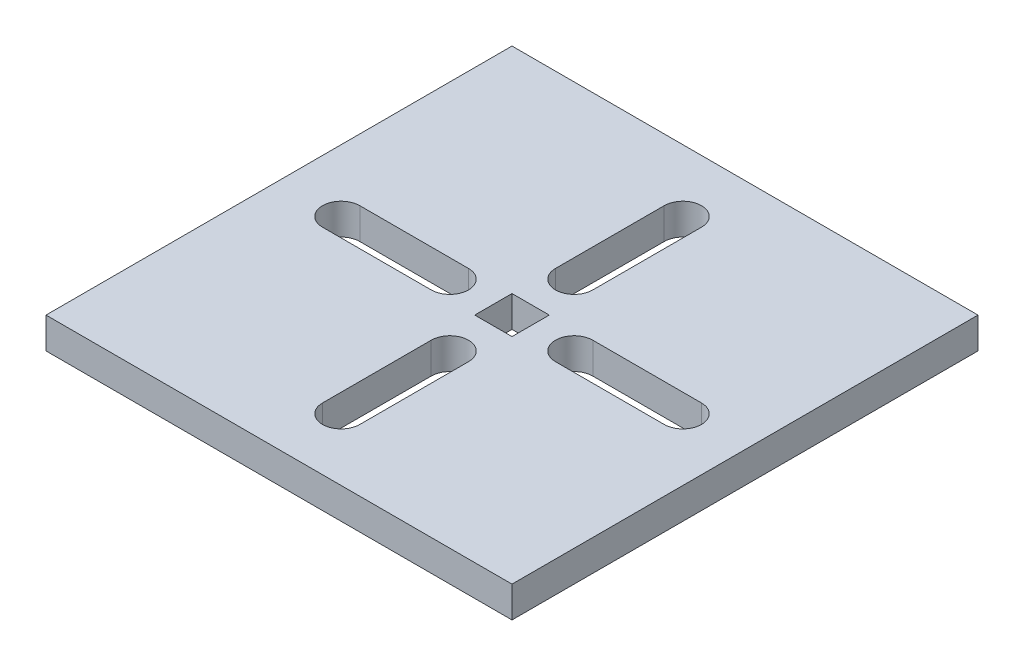
ISO-10303-21;
HEADER;
FILE_DESCRIPTION(('STEP AP214'),'2;1');
FILE_NAME('part.step','',(''),(''),'','','');
FILE_SCHEMA(('AUTOMOTIVE_DESIGN { 1 0 10303 214 1 1 1 1 }'));
ENDSEC;
DATA;
#1=APPLICATION_CONTEXT('core data for automotive mechanical design processes');
#2=APPLICATION_PROTOCOL_DEFINITION('international standard','automotive_design',2000,#1);
#3=PRODUCT_CONTEXT('',#1,'mechanical');
#4=PRODUCT('Part','Part','',(#3));
#5=PRODUCT_RELATED_PRODUCT_CATEGORY('part','',(#4));
#6=PRODUCT_DEFINITION_FORMATION('','',#4);
#7=PRODUCT_DEFINITION_CONTEXT('part definition',#1,'design');
#8=PRODUCT_DEFINITION('design','',#6,#7);
#9=PRODUCT_DEFINITION_SHAPE('','',#8);
#10=(LENGTH_UNIT() NAMED_UNIT(*) SI_UNIT(.MILLI.,.METRE.));
#11=(NAMED_UNIT(*) PLANE_ANGLE_UNIT() SI_UNIT($,.RADIAN.));
#12=(NAMED_UNIT(*) SI_UNIT($,.STERADIAN.) SOLID_ANGLE_UNIT());
#13=UNCERTAINTY_MEASURE_WITH_UNIT(LENGTH_MEASURE(1.E-05),#10,'distance_accuracy_value','');
#14=(GEOMETRIC_REPRESENTATION_CONTEXT(3) GLOBAL_UNCERTAINTY_ASSIGNED_CONTEXT((#13)) GLOBAL_UNIT_ASSIGNED_CONTEXT((#10,
#11,#12)) REPRESENTATION_CONTEXT('',''));
#15=CARTESIAN_POINT('',(0.,0.,0.));
#16=DIRECTION('',(0.,0.,1.));
#17=DIRECTION('',(1.,0.,0.));
#18=AXIS2_PLACEMENT_3D('',#15,#16,#17);
#19=CARTESIAN_POINT('',(75.0000000000455,10.,-75.0000000000455));
#20=DIRECTION('',(-1.,0.,0.));
#21=DIRECTION('',(0.,0.,1.));
#22=AXIS2_PLACEMENT_3D('',#19,#20,#21);
#23=PLANE('',#22);
#24=DIRECTION('',(0.,0.,-1.));
#25=VECTOR('',#24,1.);
#26=CARTESIAN_POINT('',(75.0000000000455,0.,-75.0000000000455));
#27=LINE('',#26,#25);
#28=CARTESIAN_POINT('',(75.0000000000455,0.,75.0000000000455));
#29=VERTEX_POINT('',#28);
#30=CARTESIAN_POINT('',(75.0000000000455,0.,-75.0000000000455));
#31=VERTEX_POINT('',#30);
#32=EDGE_CURVE('E416',#29,#31,#27,.T.);
#33=ORIENTED_EDGE('',*,*,#32,.T.);
#34=DIRECTION('',(0.,-1.,0.));
#35=VECTOR('',#34,1.);
#36=CARTESIAN_POINT('',(75.0000000000455,10.,-75.0000000000455));
#37=LINE('',#36,#35);
#38=CARTESIAN_POINT('',(75.0000000000455,10.,-75.0000000000455));
#39=VERTEX_POINT('',#38);
#40=EDGE_CURVE('E11',#39,#31,#37,.T.);
#41=ORIENTED_EDGE('',*,*,#40,.F.);
#42=DIRECTION('',(0.,0.,-1.));
#43=VECTOR('',#42,1.);
#44=CARTESIAN_POINT('',(75.0000000000455,10.,-75.0000000000455));
#45=LINE('',#44,#43);
#46=CARTESIAN_POINT('',(75.0000000000455,10.,75.0000000000455));
#47=VERTEX_POINT('',#46);
#48=EDGE_CURVE('E426',#47,#39,#45,.T.);
#49=ORIENTED_EDGE('',*,*,#48,.F.);
#50=DIRECTION('',(0.,-1.,0.));
#51=VECTOR('',#50,1.);
#52=CARTESIAN_POINT('',(75.0000000000455,10.,75.0000000000455));
#53=LINE('',#52,#51);
#54=EDGE_CURVE('E440',#47,#29,#53,.T.);
#55=ORIENTED_EDGE('',*,*,#54,.T.);
#56=EDGE_LOOP('',(#33,#41,#49,#55));
#57=FACE_BOUND('',#56,.T.);
#58=ADVANCED_FACE('F39',(#57),#23,.F.);
#59=CARTESIAN_POINT('',(-75.0000000000455,10.,-75.0000000000455));
#60=DIRECTION('',(0.,0.,1.));
#61=DIRECTION('',(1.,0.,0.));
#62=AXIS2_PLACEMENT_3D('',#59,#60,#61);
#63=PLANE('',#62);
#64=DIRECTION('',(-1.,0.,0.));
#65=VECTOR('',#64,1.);
#66=CARTESIAN_POINT('',(-75.0000000000455,0.,-75.0000000000455));
#67=LINE('',#66,#65);
#68=CARTESIAN_POINT('',(-75.0000000000455,0.,-75.0000000000455));
#69=VERTEX_POINT('',#68);
#70=EDGE_CURVE('E444',#31,#69,#67,.T.);
#71=ORIENTED_EDGE('',*,*,#70,.T.);
#72=DIRECTION('',(0.,-1.,0.));
#73=VECTOR('',#72,1.);
#74=CARTESIAN_POINT('',(-75.0000000000455,10.,-75.0000000000455));
#75=LINE('',#74,#73);
#76=CARTESIAN_POINT('',(-75.0000000000455,10.,-75.0000000000455));
#77=VERTEX_POINT('',#76);
#78=EDGE_CURVE('E47',#77,#69,#75,.T.);
#79=ORIENTED_EDGE('',*,*,#78,.F.);
#80=DIRECTION('',(-1.,0.,0.));
#81=VECTOR('',#80,1.);
#82=CARTESIAN_POINT('',(-75.0000000000455,10.,-75.0000000000455));
#83=LINE('',#82,#81);
#84=EDGE_CURVE('E430',#39,#77,#83,.T.);
#85=ORIENTED_EDGE('',*,*,#84,.F.);
#86=ORIENTED_EDGE('',*,*,#40,.T.);
#87=EDGE_LOOP('',(#71,#79,#85,#86));
#88=FACE_BOUND('',#87,.T.);
#89=ADVANCED_FACE('F479',(#88),#63,.F.);
#90=CARTESIAN_POINT('',(-75.0000000000455,10.,-75.0000000000455));
#91=DIRECTION('',(1.,0.,0.));
#92=DIRECTION('',(0.,0.,-1.));
#93=AXIS2_PLACEMENT_3D('',#90,#91,#92);
#94=PLANE('',#93);
#95=DIRECTION('',(0.,0.,1.));
#96=VECTOR('',#95,1.);
#97=CARTESIAN_POINT('',(-75.0000000000455,0.,-75.0000000000455));
#98=LINE('',#97,#96);
#99=CARTESIAN_POINT('',(-75.0000000000455,0.,75.0000000000455));
#100=VERTEX_POINT('',#99);
#101=EDGE_CURVE('E447',#69,#100,#98,.T.);
#102=ORIENTED_EDGE('',*,*,#101,.T.);
#103=DIRECTION('',(0.,-1.,0.));
#104=VECTOR('',#103,1.);
#105=CARTESIAN_POINT('',(-75.0000000000455,10.,75.0000000000455));
#106=LINE('',#105,#104);
#107=CARTESIAN_POINT('',(-75.0000000000455,10.,75.0000000000455));
#108=VERTEX_POINT('',#107);
#109=EDGE_CURVE('E455',#108,#100,#106,.T.);
#110=ORIENTED_EDGE('',*,*,#109,.F.);
#111=DIRECTION('',(0.,0.,1.));
#112=VECTOR('',#111,1.);
#113=CARTESIAN_POINT('',(-75.0000000000455,10.,-75.0000000000455));
#114=LINE('',#113,#112);
#115=EDGE_CURVE('E434',#77,#108,#114,.T.);
#116=ORIENTED_EDGE('',*,*,#115,.F.);
#117=ORIENTED_EDGE('',*,*,#78,.T.);
#118=EDGE_LOOP('',(#102,#110,#116,#117));
#119=FACE_BOUND('',#118,.T.);
#120=ADVANCED_FACE('F464',(#119),#94,.F.);
#121=CARTESIAN_POINT('',(-75.0000000000455,10.,75.0000000000455));
#122=DIRECTION('',(0.,0.,-1.));
#123=DIRECTION('',(-1.,0.,0.));
#124=AXIS2_PLACEMENT_3D('',#121,#122,#123);
#125=PLANE('',#124);
#126=DIRECTION('',(1.,0.,0.));
#127=VECTOR('',#126,1.);
#128=CARTESIAN_POINT('',(-75.0000000000455,0.,75.0000000000455));
#129=LINE('',#128,#127);
#130=EDGE_CURVE('E431',#100,#29,#129,.T.);
#131=ORIENTED_EDGE('',*,*,#130,.T.);
#132=ORIENTED_EDGE('',*,*,#54,.F.);
#133=DIRECTION('',(1.,0.,0.));
#134=VECTOR('',#133,1.);
#135=CARTESIAN_POINT('',(-75.0000000000455,10.,75.0000000000455));
#136=LINE('',#135,#134);
#137=EDGE_CURVE('E437',#108,#47,#136,.T.);
#138=ORIENTED_EDGE('',*,*,#137,.F.);
#139=ORIENTED_EDGE('',*,*,#109,.T.);
#140=EDGE_LOOP('',(#131,#132,#138,#139));
#141=FACE_BOUND('',#140,.T.);
#142=ADVANCED_FACE('F472',(#141),#125,.F.);
#143=CARTESIAN_POINT('',(0.,10.,0.));
#144=DIRECTION('',(0.,1.,0.));
#145=DIRECTION('',(0.,0.,1.));
#146=AXIS2_PLACEMENT_3D('',#143,#144,#145);
#147=PLANE('',#146);
#148=CARTESIAN_POINT('',(0.,10.,-20.));
#149=DIRECTION('',(0.,1.,0.));
#150=DIRECTION('',(1.,0.,0.));
#151=AXIS2_PLACEMENT_3D('',#148,#149,#150);
#152=CIRCLE('',#151,6.);
#153=CARTESIAN_POINT('',(-6.00000000000007,10.,-20.));
#154=VERTEX_POINT('',#153);
#155=CARTESIAN_POINT('',(5.99999999999993,10.,-20.));
#156=VERTEX_POINT('',#155);
#157=EDGE_CURVE('E54',#154,#156,#152,.T.);
#158=ORIENTED_EDGE('',*,*,#157,.F.);
#159=DIRECTION('',(0.,0.,1.));
#160=VECTOR('',#159,1.);
#161=CARTESIAN_POINT('',(-6.00000000000007,10.,-20.));
#162=LINE('',#161,#160);
#163=CARTESIAN_POINT('',(-6.00000000000019,10.,-55.));
#164=VERTEX_POINT('',#163);
#165=EDGE_CURVE('E224',#164,#154,#162,.T.);
#166=ORIENTED_EDGE('',*,*,#165,.F.);
#167=CARTESIAN_POINT('',(-1.92031473636372E-13,10.,-55.));
#168=DIRECTION('',(0.,1.,0.));
#169=DIRECTION('',(1.,0.,0.));
#170=AXIS2_PLACEMENT_3D('',#167,#168,#169);
#171=CIRCLE('',#170,6.);
#172=CARTESIAN_POINT('',(5.99999999999981,10.,-55.));
#173=VERTEX_POINT('',#172);
#174=EDGE_CURVE('E228',#173,#164,#171,.T.);
#175=ORIENTED_EDGE('',*,*,#174,.F.);
#176=DIRECTION('',(0.,0.,-1.));
#177=VECTOR('',#176,1.);
#178=CARTESIAN_POINT('',(5.99999999999993,10.,-20.));
#179=LINE('',#178,#177);
#180=EDGE_CURVE('E237',#156,#173,#179,.T.);
#181=ORIENTED_EDGE('',*,*,#180,.F.);
#182=EDGE_LOOP('',(#158,#166,#175,#181));
#183=FACE_BOUND('',#182,.T.);
#184=CARTESIAN_POINT('',(-20.,10.,0.));
#185=DIRECTION('',(0.,1.,0.));
#186=DIRECTION('',(0.,0.,-1.));
#187=AXIS2_PLACEMENT_3D('',#184,#185,#186);
#188=CIRCLE('',#187,6.);
#189=CARTESIAN_POINT('',(-20.,10.,6.));
#190=VERTEX_POINT('',#189);
#191=CARTESIAN_POINT('',(-20.,10.,-6.));
#192=VERTEX_POINT('',#191);
#193=EDGE_CURVE('E62',#190,#192,#188,.T.);
#194=ORIENTED_EDGE('',*,*,#193,.F.);
#195=DIRECTION('',(1.,0.,0.));
#196=VECTOR('',#195,1.);
#197=CARTESIAN_POINT('',(-20.,10.,6.));
#198=LINE('',#197,#196);
#199=CARTESIAN_POINT('',(-55.,10.,6.));
#200=VERTEX_POINT('',#199);
#201=EDGE_CURVE('E258',#200,#190,#198,.T.);
#202=ORIENTED_EDGE('',*,*,#201,.F.);
#203=CARTESIAN_POINT('',(-55.,10.,0.));
#204=DIRECTION('',(0.,1.,0.));
#205=DIRECTION('',(0.,0.,-1.));
#206=AXIS2_PLACEMENT_3D('',#203,#204,#205);
#207=CIRCLE('',#206,6.);
#208=CARTESIAN_POINT('',(-55.,10.,-6.));
#209=VERTEX_POINT('',#208);
#210=EDGE_CURVE('E278',#209,#200,#207,.T.);
#211=ORIENTED_EDGE('',*,*,#210,.F.);
#212=DIRECTION('',(-1.,0.,0.));
#213=VECTOR('',#212,1.);
#214=CARTESIAN_POINT('',(-20.,10.,-6.));
#215=LINE('',#214,#213);
#216=EDGE_CURVE('E273',#192,#209,#215,.T.);
#217=ORIENTED_EDGE('',*,*,#216,.F.);
#218=EDGE_LOOP('',(#194,#202,#211,#217));
#219=FACE_BOUND('',#218,.T.);
#220=CARTESIAN_POINT('',(2.09488880330588E-13,10.,20.));
#221=DIRECTION('',(0.,1.,0.));
#222=DIRECTION('',(-1.,0.,0.));
#223=AXIS2_PLACEMENT_3D('',#220,#221,#222);
#224=CIRCLE('',#223,6.);
#225=CARTESIAN_POINT('',(6.00000000000021,10.,19.9999999999999));
#226=VERTEX_POINT('',#225);
#227=CARTESIAN_POINT('',(-5.99999999999979,10.,20.0000000000001));
#228=VERTEX_POINT('',#227);
#229=EDGE_CURVE('E313',#226,#228,#224,.T.);
#230=ORIENTED_EDGE('',*,*,#229,.F.);
#231=DIRECTION('',(0.,0.,-1.));
#232=VECTOR('',#231,1.);
#233=CARTESIAN_POINT('',(6.00000000000021,10.,19.9999999999999));
#234=LINE('',#233,#232);
#235=CARTESIAN_POINT('',(6.00000000000058,10.,54.9999999999999));
#236=VERTEX_POINT('',#235);
#237=EDGE_CURVE('E300',#236,#226,#234,.T.);
#238=ORIENTED_EDGE('',*,*,#237,.F.);
#239=CARTESIAN_POINT('',(5.76094420909117E-13,10.,55.));
#240=DIRECTION('',(0.,1.,0.));
#241=DIRECTION('',(-1.,0.,0.));
#242=AXIS2_PLACEMENT_3D('',#239,#240,#241);
#243=CIRCLE('',#242,6.);
#244=CARTESIAN_POINT('',(-5.99999999999942,10.,55.0000000000001));
#245=VERTEX_POINT('',#244);
#246=EDGE_CURVE('E320',#245,#236,#243,.T.);
#247=ORIENTED_EDGE('',*,*,#246,.F.);
#248=DIRECTION('',(0.,0.,1.));
#249=VECTOR('',#248,1.);
#250=CARTESIAN_POINT('',(-5.99999999999979,10.,20.0000000000001));
#251=LINE('',#250,#249);
#252=EDGE_CURVE('E316',#228,#245,#251,.T.);
#253=ORIENTED_EDGE('',*,*,#252,.F.);
#254=EDGE_LOOP('',(#230,#238,#247,#253));
#255=FACE_BOUND('',#254,.T.);
#256=CARTESIAN_POINT('',(20.,10.,0.));
#257=DIRECTION('',(0.,1.,0.));
#258=DIRECTION('',(0.,0.,1.));
#259=AXIS2_PLACEMENT_3D('',#256,#257,#258);
#260=CIRCLE('',#259,6.);
#261=CARTESIAN_POINT('',(20.,10.,-6.));
#262=VERTEX_POINT('',#261);
#263=CARTESIAN_POINT('',(20.,10.,6.));
#264=VERTEX_POINT('',#263);
#265=EDGE_CURVE('E247',#262,#264,#260,.T.);
#266=ORIENTED_EDGE('',*,*,#265,.F.);
#267=DIRECTION('',(-1.,0.,0.));
#268=VECTOR('',#267,1.);
#269=CARTESIAN_POINT('',(20.,10.,-6.));
#270=LINE('',#269,#268);
#271=CARTESIAN_POINT('',(55.,10.,-6.));
#272=VERTEX_POINT('',#271);
#273=EDGE_CURVE('E343',#272,#262,#270,.T.);
#274=ORIENTED_EDGE('',*,*,#273,.F.);
#275=CARTESIAN_POINT('',(55.,10.,0.));
#276=DIRECTION('',(0.,1.,0.));
#277=DIRECTION('',(0.,0.,1.));
#278=AXIS2_PLACEMENT_3D('',#275,#276,#277);
#279=CIRCLE('',#278,6.);
#280=CARTESIAN_POINT('',(55.,10.,6.));
#281=VERTEX_POINT('',#280);
#282=EDGE_CURVE('E362',#281,#272,#279,.T.);
#283=ORIENTED_EDGE('',*,*,#282,.F.);
#284=DIRECTION('',(1.,0.,0.));
#285=VECTOR('',#284,1.);
#286=CARTESIAN_POINT('',(20.,10.,6.));
#287=LINE('',#286,#285);
#288=EDGE_CURVE('E358',#264,#281,#287,.T.);
#289=ORIENTED_EDGE('',*,*,#288,.F.);
#290=EDGE_LOOP('',(#266,#274,#283,#289));
#291=FACE_BOUND('',#290,.T.);
#292=DIRECTION('',(0.,0.,-1.));
#293=VECTOR('',#292,1.);
#294=CARTESIAN_POINT('',(6.,10.,-6.));
#295=LINE('',#294,#293);
#296=CARTESIAN_POINT('',(6.,10.,6.));
#297=VERTEX_POINT('',#296);
#298=CARTESIAN_POINT('',(6.,10.,-6.));
#299=VERTEX_POINT('',#298);
#300=EDGE_CURVE('E372',#297,#299,#295,.T.);
#301=ORIENTED_EDGE('',*,*,#300,.F.);
#302=DIRECTION('',(1.,0.,0.));
#303=VECTOR('',#302,1.);
#304=CARTESIAN_POINT('',(-6.,10.,6.));
#305=LINE('',#304,#303);
#306=CARTESIAN_POINT('',(-6.,10.,6.));
#307=VERTEX_POINT('',#306);
#308=EDGE_CURVE('E387',#307,#297,#305,.T.);
#309=ORIENTED_EDGE('',*,*,#308,.F.);
#310=DIRECTION('',(0.,0.,1.));
#311=VECTOR('',#310,1.);
#312=CARTESIAN_POINT('',(-6.,10.,-6.));
#313=LINE('',#312,#311);
#314=CARTESIAN_POINT('',(-6.,10.,-6.));
#315=VERTEX_POINT('',#314);
#316=EDGE_CURVE('E406',#315,#307,#313,.T.);
#317=ORIENTED_EDGE('',*,*,#316,.F.);
#318=DIRECTION('',(-1.,0.,0.));
#319=VECTOR('',#318,1.);
#320=CARTESIAN_POINT('',(-6.,10.,-6.));
#321=LINE('',#320,#319);
#322=EDGE_CURVE('E402',#299,#315,#321,.T.);
#323=ORIENTED_EDGE('',*,*,#322,.F.);
#324=EDGE_LOOP('',(#301,#309,#317,#323));
#325=FACE_BOUND('',#324,.T.);
#326=ORIENTED_EDGE('',*,*,#48,.T.);
#327=ORIENTED_EDGE('',*,*,#84,.T.);
#328=ORIENTED_EDGE('',*,*,#115,.T.);
#329=ORIENTED_EDGE('',*,*,#137,.T.);
#330=EDGE_LOOP('',(#326,#327,#328,#329));
#331=FACE_BOUND('',#330,.T.);
#332=ADVANCED_FACE('F478',(#183,#219,#255,#291,#325,#331),#147,.T.);
#333=CARTESIAN_POINT('',(0.,0.,0.));
#334=DIRECTION('',(0.,1.,0.));
#335=DIRECTION('',(0.,0.,1.));
#336=AXIS2_PLACEMENT_3D('',#333,#334,#335);
#337=PLANE('',#336);
#338=DIRECTION('',(0.,0.,1.));
#339=VECTOR('',#338,1.);
#340=CARTESIAN_POINT('',(-6.00000000000007,0.,-20.));
#341=LINE('',#340,#339);
#342=CARTESIAN_POINT('',(-6.00000000000019,0.,-55.));
#343=VERTEX_POINT('',#342);
#344=CARTESIAN_POINT('',(-6.00000000000007,0.,-20.));
#345=VERTEX_POINT('',#344);
#346=EDGE_CURVE('E209',#343,#345,#341,.T.);
#347=ORIENTED_EDGE('',*,*,#346,.T.);
#348=CARTESIAN_POINT('',(0.,0.,-20.));
#349=DIRECTION('',(0.,1.,0.));
#350=DIRECTION('',(1.,0.,0.));
#351=AXIS2_PLACEMENT_3D('',#348,#349,#350);
#352=CIRCLE('',#351,6.);
#353=CARTESIAN_POINT('',(5.99999999999993,0.,-20.));
#354=VERTEX_POINT('',#353);
#355=EDGE_CURVE('E202',#345,#354,#352,.T.);
#356=ORIENTED_EDGE('',*,*,#355,.T.);
#357=DIRECTION('',(0.,0.,-1.));
#358=VECTOR('',#357,1.);
#359=CARTESIAN_POINT('',(5.99999999999993,0.,-20.));
#360=LINE('',#359,#358);
#361=CARTESIAN_POINT('',(5.99999999999981,0.,-55.));
#362=VERTEX_POINT('',#361);
#363=EDGE_CURVE('E213',#354,#362,#360,.T.);
#364=ORIENTED_EDGE('',*,*,#363,.T.);
#365=CARTESIAN_POINT('',(-1.92031473636372E-13,0.,-55.));
#366=DIRECTION('',(0.,1.,0.));
#367=DIRECTION('',(1.,0.,0.));
#368=AXIS2_PLACEMENT_3D('',#365,#366,#367);
#369=CIRCLE('',#368,6.);
#370=EDGE_CURVE('E218',#362,#343,#369,.T.);
#371=ORIENTED_EDGE('',*,*,#370,.T.);
#372=EDGE_LOOP('',(#347,#356,#364,#371));
#373=FACE_BOUND('',#372,.T.);
#374=DIRECTION('',(1.,0.,0.));
#375=VECTOR('',#374,1.);
#376=CARTESIAN_POINT('',(-20.,0.,6.));
#377=LINE('',#376,#375);
#378=CARTESIAN_POINT('',(-55.,0.,6.));
#379=VERTEX_POINT('',#378);
#380=CARTESIAN_POINT('',(-20.,0.,6.));
#381=VERTEX_POINT('',#380);
#382=EDGE_CURVE('E266',#379,#381,#377,.T.);
#383=ORIENTED_EDGE('',*,*,#382,.T.);
#384=CARTESIAN_POINT('',(-20.,0.,0.));
#385=DIRECTION('',(0.,1.,0.));
#386=DIRECTION('',(0.,0.,-1.));
#387=AXIS2_PLACEMENT_3D('',#384,#385,#386);
#388=CIRCLE('',#387,6.);
#389=CARTESIAN_POINT('',(-20.,0.,-6.));
#390=VERTEX_POINT('',#389);
#391=EDGE_CURVE('E253',#381,#390,#388,.T.);
#392=ORIENTED_EDGE('',*,*,#391,.T.);
#393=DIRECTION('',(-1.,0.,0.));
#394=VECTOR('',#393,1.);
#395=CARTESIAN_POINT('',(-20.,0.,-6.));
#396=LINE('',#395,#394);
#397=CARTESIAN_POINT('',(-55.,0.,-6.));
#398=VERTEX_POINT('',#397);
#399=EDGE_CURVE('E257',#390,#398,#396,.T.);
#400=ORIENTED_EDGE('',*,*,#399,.T.);
#401=CARTESIAN_POINT('',(-55.,0.,0.));
#402=DIRECTION('',(0.,1.,0.));
#403=DIRECTION('',(0.,0.,-1.));
#404=AXIS2_PLACEMENT_3D('',#401,#402,#403);
#405=CIRCLE('',#404,6.);
#406=EDGE_CURVE('E262',#398,#379,#405,.T.);
#407=ORIENTED_EDGE('',*,*,#406,.T.);
#408=EDGE_LOOP('',(#383,#392,#400,#407));
#409=FACE_BOUND('',#408,.T.);
#410=DIRECTION('',(0.,0.,-1.));
#411=VECTOR('',#410,1.);
#412=CARTESIAN_POINT('',(6.00000000000021,0.,19.9999999999999));
#413=LINE('',#412,#411);
#414=CARTESIAN_POINT('',(6.00000000000058,0.,54.9999999999999));
#415=VERTEX_POINT('',#414);
#416=CARTESIAN_POINT('',(6.00000000000021,0.,19.9999999999999));
#417=VERTEX_POINT('',#416);
#418=EDGE_CURVE('E308',#415,#417,#413,.T.);
#419=ORIENTED_EDGE('',*,*,#418,.T.);
#420=CARTESIAN_POINT('',(2.09488880330588E-13,0.,20.));
#421=DIRECTION('',(0.,1.,0.));
#422=DIRECTION('',(-1.,0.,0.));
#423=AXIS2_PLACEMENT_3D('',#420,#421,#422);
#424=CIRCLE('',#423,6.);
#425=CARTESIAN_POINT('',(-5.99999999999979,0.,20.0000000000001));
#426=VERTEX_POINT('',#425);
#427=EDGE_CURVE('E295',#417,#426,#424,.T.);
#428=ORIENTED_EDGE('',*,*,#427,.T.);
#429=DIRECTION('',(0.,0.,1.));
#430=VECTOR('',#429,1.);
#431=CARTESIAN_POINT('',(-5.99999999999979,0.,20.0000000000001));
#432=LINE('',#431,#430);
#433=CARTESIAN_POINT('',(-5.99999999999942,0.,55.0000000000001));
#434=VERTEX_POINT('',#433);
#435=EDGE_CURVE('E299',#426,#434,#432,.T.);
#436=ORIENTED_EDGE('',*,*,#435,.T.);
#437=CARTESIAN_POINT('',(5.76094420909117E-13,0.,55.));
#438=DIRECTION('',(0.,1.,0.));
#439=DIRECTION('',(-1.,0.,0.));
#440=AXIS2_PLACEMENT_3D('',#437,#438,#439);
#441=CIRCLE('',#440,6.);
#442=EDGE_CURVE('E304',#434,#415,#441,.T.);
#443=ORIENTED_EDGE('',*,*,#442,.T.);
#444=EDGE_LOOP('',(#419,#428,#436,#443));
#445=FACE_BOUND('',#444,.T.);
#446=DIRECTION('',(-1.,0.,0.));
#447=VECTOR('',#446,1.);
#448=CARTESIAN_POINT('',(20.,0.,-6.));
#449=LINE('',#448,#447);
#450=CARTESIAN_POINT('',(55.,0.,-6.));
#451=VERTEX_POINT('',#450);
#452=CARTESIAN_POINT('',(20.,0.,-6.));
#453=VERTEX_POINT('',#452);
#454=EDGE_CURVE('E351',#451,#453,#449,.T.);
#455=ORIENTED_EDGE('',*,*,#454,.T.);
#456=CARTESIAN_POINT('',(20.,0.,0.));
#457=DIRECTION('',(0.,1.,0.));
#458=DIRECTION('',(0.,0.,1.));
#459=AXIS2_PLACEMENT_3D('',#456,#457,#458);
#460=CIRCLE('',#459,6.);
#461=CARTESIAN_POINT('',(20.,0.,6.));
#462=VERTEX_POINT('',#461);
#463=EDGE_CURVE('E338',#453,#462,#460,.T.);
#464=ORIENTED_EDGE('',*,*,#463,.T.);
#465=DIRECTION('',(1.,0.,0.));
#466=VECTOR('',#465,1.);
#467=CARTESIAN_POINT('',(20.,0.,6.));
#468=LINE('',#467,#466);
#469=CARTESIAN_POINT('',(55.,0.,6.));
#470=VERTEX_POINT('',#469);
#471=EDGE_CURVE('E342',#462,#470,#468,.T.);
#472=ORIENTED_EDGE('',*,*,#471,.T.);
#473=CARTESIAN_POINT('',(55.,0.,0.));
#474=DIRECTION('',(0.,1.,0.));
#475=DIRECTION('',(0.,0.,1.));
#476=AXIS2_PLACEMENT_3D('',#473,#474,#475);
#477=CIRCLE('',#476,6.);
#478=EDGE_CURVE('E347',#470,#451,#477,.T.);
#479=ORIENTED_EDGE('',*,*,#478,.T.);
#480=EDGE_LOOP('',(#455,#464,#472,#479));
#481=FACE_BOUND('',#480,.T.);
#482=DIRECTION('',(1.,0.,0.));
#483=VECTOR('',#482,1.);
#484=CARTESIAN_POINT('',(-6.,0.,6.));
#485=LINE('',#484,#483);
#486=CARTESIAN_POINT('',(-6.,0.,6.));
#487=VERTEX_POINT('',#486);
#488=CARTESIAN_POINT('',(6.,0.,6.));
#489=VERTEX_POINT('',#488);
#490=EDGE_CURVE('E395',#487,#489,#485,.T.);
#491=ORIENTED_EDGE('',*,*,#490,.T.);
#492=DIRECTION('',(0.,0.,-1.));
#493=VECTOR('',#492,1.);
#494=CARTESIAN_POINT('',(6.,0.,-6.));
#495=LINE('',#494,#493);
#496=CARTESIAN_POINT('',(6.,0.,-6.));
#497=VERTEX_POINT('',#496);
#498=EDGE_CURVE('E382',#489,#497,#495,.T.);
#499=ORIENTED_EDGE('',*,*,#498,.T.);
#500=DIRECTION('',(-1.,0.,0.));
#501=VECTOR('',#500,1.);
#502=CARTESIAN_POINT('',(-6.,0.,-6.));
#503=LINE('',#502,#501);
#504=CARTESIAN_POINT('',(-6.,0.,-6.));
#505=VERTEX_POINT('',#504);
#506=EDGE_CURVE('E386',#497,#505,#503,.T.);
#507=ORIENTED_EDGE('',*,*,#506,.T.);
#508=DIRECTION('',(0.,0.,1.));
#509=VECTOR('',#508,1.);
#510=CARTESIAN_POINT('',(-6.,0.,-6.));
#511=LINE('',#510,#509);
#512=EDGE_CURVE('E391',#505,#487,#511,.T.);
#513=ORIENTED_EDGE('',*,*,#512,.T.);
#514=EDGE_LOOP('',(#491,#499,#507,#513));
#515=FACE_BOUND('',#514,.T.);
#516=ORIENTED_EDGE('',*,*,#32,.F.);
#517=ORIENTED_EDGE('',*,*,#130,.F.);
#518=ORIENTED_EDGE('',*,*,#101,.F.);
#519=ORIENTED_EDGE('',*,*,#70,.F.);
#520=EDGE_LOOP('',(#516,#517,#518,#519));
#521=FACE_BOUND('',#520,.T.);
#522=ADVANCED_FACE('F220',(#373,#409,#445,#481,#515,#521),#337,.F.);
#523=CARTESIAN_POINT('',(6.,0.,-6.));
#524=DIRECTION('',(1.,0.,0.));
#525=DIRECTION('',(0.,0.,-1.));
#526=AXIS2_PLACEMENT_3D('',#523,#524,#525);
#527=PLANE('',#526);
#528=ORIENTED_EDGE('',*,*,#300,.T.);
#529=DIRECTION('',(0.,1.,0.));
#530=VECTOR('',#529,1.);
#531=CARTESIAN_POINT('',(6.,0.,-6.));
#532=LINE('',#531,#530);
#533=EDGE_CURVE('E399',#497,#299,#532,.T.);
#534=ORIENTED_EDGE('',*,*,#533,.F.);
#535=ORIENTED_EDGE('',*,*,#498,.F.);
#536=DIRECTION('',(0.,1.,0.));
#537=VECTOR('',#536,1.);
#538=CARTESIAN_POINT('',(6.,0.,6.));
#539=LINE('',#538,#537);
#540=EDGE_CURVE('E413',#489,#297,#539,.T.);
#541=ORIENTED_EDGE('',*,*,#540,.T.);
#542=EDGE_LOOP('',(#528,#534,#535,#541));
#543=FACE_BOUND('',#542,.T.);
#544=ADVANCED_FACE('F491',(#543),#527,.F.);
#545=CARTESIAN_POINT('',(-6.,0.,6.));
#546=DIRECTION('',(0.,0.,1.));
#547=DIRECTION('',(1.,0.,0.));
#548=AXIS2_PLACEMENT_3D('',#545,#546,#547);
#549=PLANE('',#548);
#550=ORIENTED_EDGE('',*,*,#308,.T.);
#551=ORIENTED_EDGE('',*,*,#540,.F.);
#552=ORIENTED_EDGE('',*,*,#490,.F.);
#553=DIRECTION('',(0.,1.,0.));
#554=VECTOR('',#553,1.);
#555=CARTESIAN_POINT('',(-6.,0.,6.));
#556=LINE('',#555,#554);
#557=EDGE_CURVE('E417',#487,#307,#556,.T.);
#558=ORIENTED_EDGE('',*,*,#557,.T.);
#559=EDGE_LOOP('',(#550,#551,#552,#558));
#560=FACE_BOUND('',#559,.T.);
#561=ADVANCED_FACE('F497',(#560),#549,.F.);
#562=CARTESIAN_POINT('',(-6.,0.,-6.));
#563=DIRECTION('',(-1.,0.,0.));
#564=DIRECTION('',(0.,0.,1.));
#565=AXIS2_PLACEMENT_3D('',#562,#563,#564);
#566=PLANE('',#565);
#567=ORIENTED_EDGE('',*,*,#316,.T.);
#568=ORIENTED_EDGE('',*,*,#557,.F.);
#569=ORIENTED_EDGE('',*,*,#512,.F.);
#570=DIRECTION('',(0.,1.,0.));
#571=VECTOR('',#570,1.);
#572=CARTESIAN_POINT('',(-6.,0.,-6.));
#573=LINE('',#572,#571);
#574=EDGE_CURVE('E420',#505,#315,#573,.T.);
#575=ORIENTED_EDGE('',*,*,#574,.T.);
#576=EDGE_LOOP('',(#567,#568,#569,#575));
#577=FACE_BOUND('',#576,.T.);
#578=ADVANCED_FACE('F503',(#577),#566,.F.);
#579=CARTESIAN_POINT('',(-6.,0.,-6.));
#580=DIRECTION('',(0.,0.,-1.));
#581=DIRECTION('',(-1.,0.,0.));
#582=AXIS2_PLACEMENT_3D('',#579,#580,#581);
#583=PLANE('',#582);
#584=ORIENTED_EDGE('',*,*,#322,.T.);
#585=ORIENTED_EDGE('',*,*,#574,.F.);
#586=ORIENTED_EDGE('',*,*,#506,.F.);
#587=ORIENTED_EDGE('',*,*,#533,.T.);
#588=EDGE_LOOP('',(#584,#585,#586,#587));
#589=FACE_BOUND('',#588,.T.);
#590=ADVANCED_FACE('F499',(#589),#583,.F.);
#591=CARTESIAN_POINT('',(20.,0.,0.));
#592=DIRECTION('',(0.,1.,0.));
#593=DIRECTION('',(0.,0.,1.));
#594=AXIS2_PLACEMENT_3D('',#591,#592,#593);
#595=CYLINDRICAL_SURFACE('',#594,6.);
#596=ORIENTED_EDGE('',*,*,#265,.T.);
#597=DIRECTION('',(0.,1.,0.));
#598=VECTOR('',#597,1.);
#599=CARTESIAN_POINT('',(20.,0.,6.));
#600=LINE('',#599,#598);
#601=EDGE_CURVE('E355',#462,#264,#600,.T.);
#602=ORIENTED_EDGE('',*,*,#601,.F.);
#603=ORIENTED_EDGE('',*,*,#463,.F.);
#604=DIRECTION('',(0.,1.,0.));
#605=VECTOR('',#604,1.);
#606=CARTESIAN_POINT('',(20.,0.,-6.));
#607=LINE('',#606,#605);
#608=EDGE_CURVE('E369',#453,#262,#607,.T.);
#609=ORIENTED_EDGE('',*,*,#608,.T.);
#610=EDGE_LOOP('',(#596,#602,#603,#609));
#611=FACE_BOUND('',#610,.T.);
#612=ADVANCED_FACE('F502',(#611),#595,.F.);
#613=CARTESIAN_POINT('',(20.,0.,-6.));
#614=DIRECTION('',(0.,0.,-1.));
#615=DIRECTION('',(-1.,0.,0.));
#616=AXIS2_PLACEMENT_3D('',#613,#614,#615);
#617=PLANE('',#616);
#618=ORIENTED_EDGE('',*,*,#273,.T.);
#619=ORIENTED_EDGE('',*,*,#608,.F.);
#620=ORIENTED_EDGE('',*,*,#454,.F.);
#621=DIRECTION('',(0.,1.,0.));
#622=VECTOR('',#621,1.);
#623=CARTESIAN_POINT('',(55.,0.,-6.));
#624=LINE('',#623,#622);
#625=EDGE_CURVE('E373',#451,#272,#624,.T.);
#626=ORIENTED_EDGE('',*,*,#625,.T.);
#627=EDGE_LOOP('',(#618,#619,#620,#626));
#628=FACE_BOUND('',#627,.T.);
#629=ADVANCED_FACE('F513',(#628),#617,.F.);
#630=CARTESIAN_POINT('',(55.,0.,0.));
#631=DIRECTION('',(0.,1.,0.));
#632=DIRECTION('',(0.,0.,1.));
#633=AXIS2_PLACEMENT_3D('',#630,#631,#632);
#634=CYLINDRICAL_SURFACE('',#633,6.);
#635=ORIENTED_EDGE('',*,*,#282,.T.);
#636=ORIENTED_EDGE('',*,*,#625,.F.);
#637=ORIENTED_EDGE('',*,*,#478,.F.);
#638=DIRECTION('',(0.,1.,0.));
#639=VECTOR('',#638,1.);
#640=CARTESIAN_POINT('',(55.,0.,6.));
#641=LINE('',#640,#639);
#642=EDGE_CURVE('E376',#470,#281,#641,.T.);
#643=ORIENTED_EDGE('',*,*,#642,.T.);
#644=EDGE_LOOP('',(#635,#636,#637,#643));
#645=FACE_BOUND('',#644,.T.);
#646=ADVANCED_FACE('F519',(#645),#634,.F.);
#647=CARTESIAN_POINT('',(20.,0.,6.));
#648=DIRECTION('',(0.,0.,1.));
#649=DIRECTION('',(1.,0.,0.));
#650=AXIS2_PLACEMENT_3D('',#647,#648,#649);
#651=PLANE('',#650);
#652=ORIENTED_EDGE('',*,*,#288,.T.);
#653=ORIENTED_EDGE('',*,*,#642,.F.);
#654=ORIENTED_EDGE('',*,*,#471,.F.);
#655=ORIENTED_EDGE('',*,*,#601,.T.);
#656=EDGE_LOOP('',(#652,#653,#654,#655));
#657=FACE_BOUND('',#656,.T.);
#658=ADVANCED_FACE('F515',(#657),#651,.F.);
#659=CARTESIAN_POINT('',(2.09488880330588E-13,0.,20.));
#660=DIRECTION('',(0.,1.,0.));
#661=DIRECTION('',(0.,0.,1.));
#662=AXIS2_PLACEMENT_3D('',#659,#660,#661);
#663=CYLINDRICAL_SURFACE('',#662,6.);
#664=ORIENTED_EDGE('',*,*,#229,.T.);
#665=DIRECTION('',(0.,1.,0.));
#666=VECTOR('',#665,1.);
#667=CARTESIAN_POINT('',(-5.99999999999979,0.,20.0000000000001));
#668=LINE('',#667,#666);
#669=EDGE_CURVE('E312',#426,#228,#668,.T.);
#670=ORIENTED_EDGE('',*,*,#669,.F.);
#671=ORIENTED_EDGE('',*,*,#427,.F.);
#672=DIRECTION('',(0.,1.,0.));
#673=VECTOR('',#672,1.);
#674=CARTESIAN_POINT('',(6.00000000000021,0.,19.9999999999999));
#675=LINE('',#674,#673);
#676=EDGE_CURVE('E274',#417,#226,#675,.T.);
#677=ORIENTED_EDGE('',*,*,#676,.T.);
#678=EDGE_LOOP('',(#664,#670,#671,#677));
#679=FACE_BOUND('',#678,.T.);
#680=ADVANCED_FACE('F518',(#679),#663,.F.);
#681=CARTESIAN_POINT('',(6.00000000000021,0.,19.9999999999999));
#682=DIRECTION('',(1.,0.,0.));
#683=DIRECTION('',(0.,0.,-1.));
#684=AXIS2_PLACEMENT_3D('',#681,#682,#683);
#685=PLANE('',#684);
#686=ORIENTED_EDGE('',*,*,#237,.T.);
#687=ORIENTED_EDGE('',*,*,#676,.F.);
#688=ORIENTED_EDGE('',*,*,#418,.F.);
#689=DIRECTION('',(0.,1.,0.));
#690=VECTOR('',#689,1.);
#691=CARTESIAN_POINT('',(6.00000000000058,0.,54.9999999999999));
#692=LINE('',#691,#690);
#693=EDGE_CURVE('E329',#415,#236,#692,.T.);
#694=ORIENTED_EDGE('',*,*,#693,.T.);
#695=EDGE_LOOP('',(#686,#687,#688,#694));
#696=FACE_BOUND('',#695,.T.);
#697=ADVANCED_FACE('F529',(#696),#685,.F.);
#698=CARTESIAN_POINT('',(5.76094420909117E-13,0.,55.));
#699=DIRECTION('',(0.,1.,0.));
#700=DIRECTION('',(0.,0.,1.));
#701=AXIS2_PLACEMENT_3D('',#698,#699,#700);
#702=CYLINDRICAL_SURFACE('',#701,6.);
#703=ORIENTED_EDGE('',*,*,#246,.T.);
#704=ORIENTED_EDGE('',*,*,#693,.F.);
#705=ORIENTED_EDGE('',*,*,#442,.F.);
#706=DIRECTION('',(0.,1.,0.));
#707=VECTOR('',#706,1.);
#708=CARTESIAN_POINT('',(-5.99999999999942,0.,55.0000000000001));
#709=LINE('',#708,#707);
#710=EDGE_CURVE('E332',#434,#245,#709,.T.);
#711=ORIENTED_EDGE('',*,*,#710,.T.);
#712=EDGE_LOOP('',(#703,#704,#705,#711));
#713=FACE_BOUND('',#712,.T.);
#714=ADVANCED_FACE('F535',(#713),#702,.F.);
#715=CARTESIAN_POINT('',(-5.99999999999979,0.,20.0000000000001));
#716=DIRECTION('',(-1.,0.,0.));
#717=DIRECTION('',(0.,0.,1.));
#718=AXIS2_PLACEMENT_3D('',#715,#716,#717);
#719=PLANE('',#718);
#720=ORIENTED_EDGE('',*,*,#252,.T.);
#721=ORIENTED_EDGE('',*,*,#710,.F.);
#722=ORIENTED_EDGE('',*,*,#435,.F.);
#723=ORIENTED_EDGE('',*,*,#669,.T.);
#724=EDGE_LOOP('',(#720,#721,#722,#723));
#725=FACE_BOUND('',#724,.T.);
#726=ADVANCED_FACE('F531',(#725),#719,.F.);
#727=CARTESIAN_POINT('',(-20.,0.,0.));
#728=DIRECTION('',(0.,1.,0.));
#729=DIRECTION('',(0.,0.,1.));
#730=AXIS2_PLACEMENT_3D('',#727,#728,#729);
#731=CYLINDRICAL_SURFACE('',#730,6.);
#732=ORIENTED_EDGE('',*,*,#193,.T.);
#733=DIRECTION('',(0.,1.,0.));
#734=VECTOR('',#733,1.);
#735=CARTESIAN_POINT('',(-20.,0.,-6.));
#736=LINE('',#735,#734);
#737=EDGE_CURVE('E270',#390,#192,#736,.T.);
#738=ORIENTED_EDGE('',*,*,#737,.F.);
#739=ORIENTED_EDGE('',*,*,#391,.F.);
#740=DIRECTION('',(0.,1.,0.));
#741=VECTOR('',#740,1.);
#742=CARTESIAN_POINT('',(-20.,0.,6.));
#743=LINE('',#742,#741);
#744=EDGE_CURVE('E238',#381,#190,#743,.T.);
#745=ORIENTED_EDGE('',*,*,#744,.T.);
#746=EDGE_LOOP('',(#732,#738,#739,#745));
#747=FACE_BOUND('',#746,.T.);
#748=ADVANCED_FACE('F534',(#747),#731,.F.);
#749=CARTESIAN_POINT('',(-20.,0.,6.));
#750=DIRECTION('',(0.,0.,1.));
#751=DIRECTION('',(1.,0.,0.));
#752=AXIS2_PLACEMENT_3D('',#749,#750,#751);
#753=PLANE('',#752);
#754=ORIENTED_EDGE('',*,*,#201,.T.);
#755=ORIENTED_EDGE('',*,*,#744,.F.);
#756=ORIENTED_EDGE('',*,*,#382,.F.);
#757=DIRECTION('',(0.,1.,0.));
#758=VECTOR('',#757,1.);
#759=CARTESIAN_POINT('',(-55.,0.,6.));
#760=LINE('',#759,#758);
#761=EDGE_CURVE('E287',#379,#200,#760,.T.);
#762=ORIENTED_EDGE('',*,*,#761,.T.);
#763=EDGE_LOOP('',(#754,#755,#756,#762));
#764=FACE_BOUND('',#763,.T.);
#765=ADVANCED_FACE('F545',(#764),#753,.F.);
#766=CARTESIAN_POINT('',(-55.,0.,0.));
#767=DIRECTION('',(0.,1.,0.));
#768=DIRECTION('',(0.,0.,1.));
#769=AXIS2_PLACEMENT_3D('',#766,#767,#768);
#770=CYLINDRICAL_SURFACE('',#769,6.);
#771=ORIENTED_EDGE('',*,*,#210,.T.);
#772=ORIENTED_EDGE('',*,*,#761,.F.);
#773=ORIENTED_EDGE('',*,*,#406,.F.);
#774=DIRECTION('',(0.,1.,0.));
#775=VECTOR('',#774,1.);
#776=CARTESIAN_POINT('',(-55.,0.,-6.));
#777=LINE('',#776,#775);
#778=EDGE_CURVE('E290',#398,#209,#777,.T.);
#779=ORIENTED_EDGE('',*,*,#778,.T.);
#780=EDGE_LOOP('',(#771,#772,#773,#779));
#781=FACE_BOUND('',#780,.T.);
#782=ADVANCED_FACE('F549',(#781),#770,.F.);
#783=CARTESIAN_POINT('',(-20.,0.,-6.));
#784=DIRECTION('',(0.,0.,-1.));
#785=DIRECTION('',(-1.,0.,0.));
#786=AXIS2_PLACEMENT_3D('',#783,#784,#785);
#787=PLANE('',#786);
#788=ORIENTED_EDGE('',*,*,#216,.T.);
#789=ORIENTED_EDGE('',*,*,#778,.F.);
#790=ORIENTED_EDGE('',*,*,#399,.F.);
#791=ORIENTED_EDGE('',*,*,#737,.T.);
#792=EDGE_LOOP('',(#788,#789,#790,#791));
#793=FACE_BOUND('',#792,.T.);
#794=ADVANCED_FACE('F546',(#793),#787,.F.);
#795=CARTESIAN_POINT('',(0.,0.,-20.));
#796=DIRECTION('',(0.,1.,0.));
#797=DIRECTION('',(0.,0.,1.));
#798=AXIS2_PLACEMENT_3D('',#795,#796,#797);
#799=CYLINDRICAL_SURFACE('',#798,6.);
#800=ORIENTED_EDGE('',*,*,#157,.T.);
#801=DIRECTION('',(0.,1.,0.));
#802=VECTOR('',#801,1.);
#803=CARTESIAN_POINT('',(5.99999999999993,0.,-20.));
#804=LINE('',#803,#802);
#805=EDGE_CURVE('E198',#354,#156,#804,.T.);
#806=ORIENTED_EDGE('',*,*,#805,.F.);
#807=ORIENTED_EDGE('',*,*,#355,.F.);
#808=DIRECTION('',(0.,1.,0.));
#809=VECTOR('',#808,1.);
#810=CARTESIAN_POINT('',(-6.00000000000007,0.,-20.));
#811=LINE('',#810,#809);
#812=EDGE_CURVE('E244',#345,#154,#811,.T.);
#813=ORIENTED_EDGE('',*,*,#812,.T.);
#814=EDGE_LOOP('',(#800,#806,#807,#813));
#815=FACE_BOUND('',#814,.T.);
#816=ADVANCED_FACE('F200',(#815),#799,.F.);
#817=CARTESIAN_POINT('',(-6.00000000000007,0.,-20.));
#818=DIRECTION('',(-1.,0.,0.));
#819=DIRECTION('',(0.,0.,1.));
#820=AXIS2_PLACEMENT_3D('',#817,#818,#819);
#821=PLANE('',#820);
#822=ORIENTED_EDGE('',*,*,#165,.T.);
#823=ORIENTED_EDGE('',*,*,#812,.F.);
#824=ORIENTED_EDGE('',*,*,#346,.F.);
#825=DIRECTION('',(0.,1.,0.));
#826=VECTOR('',#825,1.);
#827=CARTESIAN_POINT('',(-6.00000000000019,0.,-55.));
#828=LINE('',#827,#826);
#829=EDGE_CURVE('E248',#343,#164,#828,.T.);
#830=ORIENTED_EDGE('',*,*,#829,.T.);
#831=EDGE_LOOP('',(#822,#823,#824,#830));
#832=FACE_BOUND('',#831,.T.);
#833=ADVANCED_FACE('F559',(#832),#821,.F.);
#834=CARTESIAN_POINT('',(-1.92031473636372E-13,0.,-55.));
#835=DIRECTION('',(0.,1.,0.));
#836=DIRECTION('',(0.,0.,1.));
#837=AXIS2_PLACEMENT_3D('',#834,#835,#836);
#838=CYLINDRICAL_SURFACE('',#837,6.);
#839=ORIENTED_EDGE('',*,*,#174,.T.);
#840=ORIENTED_EDGE('',*,*,#829,.F.);
#841=ORIENTED_EDGE('',*,*,#370,.F.);
#842=DIRECTION('',(0.,1.,0.));
#843=VECTOR('',#842,1.);
#844=CARTESIAN_POINT('',(5.99999999999981,0.,-55.));
#845=LINE('',#844,#843);
#846=EDGE_CURVE('E208',#362,#173,#845,.T.);
#847=ORIENTED_EDGE('',*,*,#846,.T.);
#848=EDGE_LOOP('',(#839,#840,#841,#847));
#849=FACE_BOUND('',#848,.T.);
#850=ADVANCED_FACE('F562',(#849),#838,.F.);
#851=CARTESIAN_POINT('',(5.99999999999993,0.,-20.));
#852=DIRECTION('',(1.,0.,0.));
#853=DIRECTION('',(0.,0.,-1.));
#854=AXIS2_PLACEMENT_3D('',#851,#852,#853);
#855=PLANE('',#854);
#856=ORIENTED_EDGE('',*,*,#180,.T.);
#857=ORIENTED_EDGE('',*,*,#846,.F.);
#858=ORIENTED_EDGE('',*,*,#363,.F.);
#859=ORIENTED_EDGE('',*,*,#805,.T.);
#860=EDGE_LOOP('',(#856,#857,#858,#859));
#861=FACE_BOUND('',#860,.T.);
#862=ADVANCED_FACE('F214',(#861),#855,.F.);
#863=CLOSED_SHELL('',(#58,#89,#120,#142,#332,#522,#544,#561,#578,#590,#612,#629,#646,#658,#680,
#697,#714,#726,#748,#765,#782,#794,#816,#833,#850,#862));
#864=MANIFOLD_SOLID_BREP('B2',#863);
#865=ADVANCED_BREP_SHAPE_REPRESENTATION('',(#18,#864),#14);
#866=SHAPE_DEFINITION_REPRESENTATION(#9,#865);
ENDSEC;
END-ISO-10303-21;
